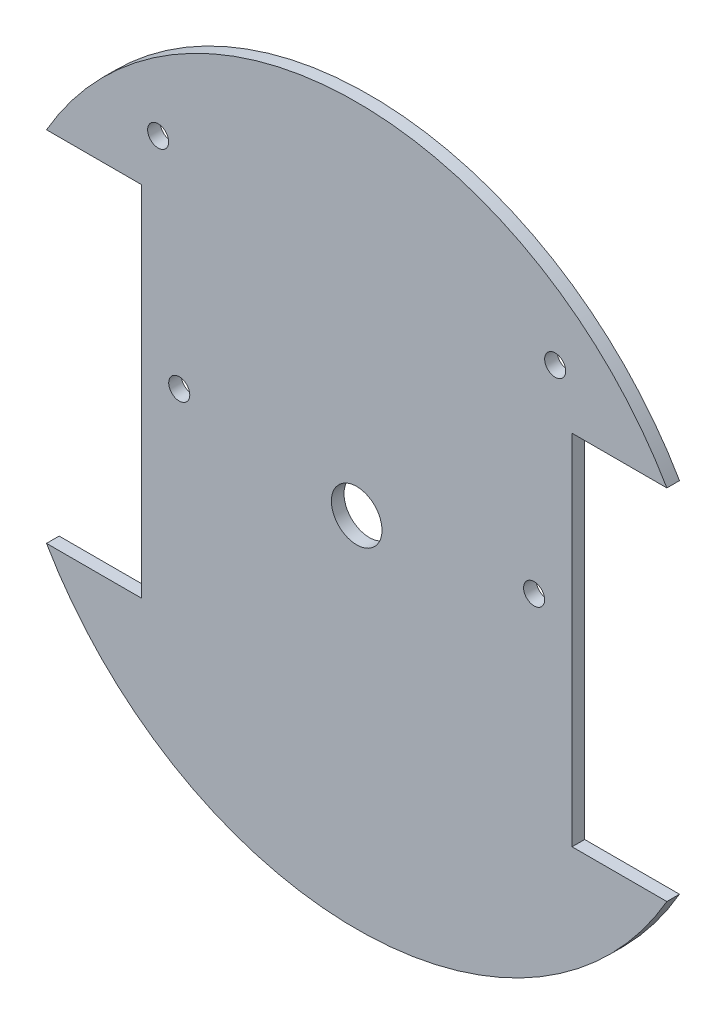
ISO-10303-21;
HEADER;
FILE_DESCRIPTION(('STEP AP214'),'2;1');
FILE_NAME('part.step','',(''),(''),'','','');
FILE_SCHEMA(('AUTOMOTIVE_DESIGN { 1 0 10303 214 1 1 1 1 }'));
ENDSEC;
DATA;
#1=APPLICATION_CONTEXT('core data for automotive mechanical design processes');
#2=APPLICATION_PROTOCOL_DEFINITION('international standard','automotive_design',2000,#1);
#3=PRODUCT_CONTEXT('',#1,'mechanical');
#4=PRODUCT('Part','Part','',(#3));
#5=PRODUCT_RELATED_PRODUCT_CATEGORY('part','',(#4));
#6=PRODUCT_DEFINITION_FORMATION('','',#4);
#7=PRODUCT_DEFINITION_CONTEXT('part definition',#1,'design');
#8=PRODUCT_DEFINITION('design','',#6,#7);
#9=PRODUCT_DEFINITION_SHAPE('','',#8);
#10=(LENGTH_UNIT() NAMED_UNIT(*) SI_UNIT(.MILLI.,.METRE.));
#11=(NAMED_UNIT(*) PLANE_ANGLE_UNIT() SI_UNIT($,.RADIAN.));
#12=(NAMED_UNIT(*) SI_UNIT($,.STERADIAN.) SOLID_ANGLE_UNIT());
#13=UNCERTAINTY_MEASURE_WITH_UNIT(LENGTH_MEASURE(1.E-05),#10,'distance_accuracy_value','');
#14=(GEOMETRIC_REPRESENTATION_CONTEXT(3) GLOBAL_UNCERTAINTY_ASSIGNED_CONTEXT((#13)) GLOBAL_UNIT_ASSIGNED_CONTEXT((#10,
#11,#12)) REPRESENTATION_CONTEXT('',''));
#15=CARTESIAN_POINT('',(0.,0.,0.));
#16=DIRECTION('',(0.,0.,1.));
#17=DIRECTION('',(1.,0.,0.));
#18=AXIS2_PLACEMENT_3D('',#15,#16,#17);
#19=CARTESIAN_POINT('',(-147.959743570363,62.548931244192,3.));
#20=DIRECTION('',(0.,0.,1.));
#21=DIRECTION('',(1.,0.,0.));
#22=AXIS2_PLACEMENT_3D('',#19,#20,#21);
#23=PLANE('',#22);
#24=CARTESIAN_POINT('',(-147.959743570363,62.548931244192,3.));
#25=DIRECTION('',(0.,0.,1.));
#26=DIRECTION('',(1.,0.,0.));
#27=AXIS2_PLACEMENT_3D('',#24,#25,#26);
#28=CIRCLE('',#27,6.00000000000002);
#29=CARTESIAN_POINT('',(-141.959743570363,62.548931244192,3.));
#30=VERTEX_POINT('',#29);
#31=EDGE_CURVE('E197',#30,#30,#28,.T.);
#32=ORIENTED_EDGE('',*,*,#31,.F.);
#33=EDGE_LOOP('',(#32));
#34=FACE_BOUND('',#33,.T.);
#35=CARTESIAN_POINT('',(-195.07190289204,117.048931244192,3.));
#36=DIRECTION('',(0.,0.,1.));
#37=DIRECTION('',(1.,0.,0.));
#38=AXIS2_PLACEMENT_3D('',#35,#36,#37);
#39=CIRCLE('',#38,2.5);
#40=CARTESIAN_POINT('',(-192.57190289204,117.048931244192,3.));
#41=VERTEX_POINT('',#40);
#42=EDGE_CURVE('E185',#41,#41,#39,.T.);
#43=ORIENTED_EDGE('',*,*,#42,.F.);
#44=EDGE_LOOP('',(#43));
#45=FACE_BOUND('',#44,.T.);
#46=CARTESIAN_POINT('',(-100.847584248686,117.048931244192,3.));
#47=DIRECTION('',(0.,0.,1.));
#48=DIRECTION('',(1.,0.,0.));
#49=AXIS2_PLACEMENT_3D('',#46,#47,#48);
#50=CIRCLE('',#49,2.50000000000001);
#51=CARTESIAN_POINT('',(-98.3475842486856,117.048931244192,3.));
#52=VERTEX_POINT('',#51);
#53=EDGE_CURVE('E190',#52,#52,#50,.T.);
#54=ORIENTED_EDGE('',*,*,#53,.F.);
#55=EDGE_LOOP('',(#54));
#56=FACE_BOUND('',#55,.T.);
#57=CARTESIAN_POINT('',(-190.07190289204,67.548931244192,3.));
#58=DIRECTION('',(0.,0.,1.));
#59=DIRECTION('',(1.,0.,0.));
#60=AXIS2_PLACEMENT_3D('',#57,#58,#59);
#61=CIRCLE('',#60,2.5);
#62=CARTESIAN_POINT('',(-187.57190289204,67.548931244192,3.));
#63=VERTEX_POINT('',#62);
#64=EDGE_CURVE('E161',#63,#63,#61,.T.);
#65=ORIENTED_EDGE('',*,*,#64,.F.);
#66=EDGE_LOOP('',(#65));
#67=FACE_BOUND('',#66,.T.);
#68=CARTESIAN_POINT('',(-105.847584248686,67.548931244192,3.));
#69=DIRECTION('',(0.,0.,1.));
#70=DIRECTION('',(1.,0.,0.));
#71=AXIS2_PLACEMENT_3D('',#68,#69,#70);
#72=CIRCLE('',#71,2.5);
#73=CARTESIAN_POINT('',(-103.347584248686,67.548931244192,3.));
#74=VERTEX_POINT('',#73);
#75=EDGE_CURVE('E178',#74,#74,#72,.T.);
#76=ORIENTED_EDGE('',*,*,#75,.F.);
#77=EDGE_LOOP('',(#76));
#78=FACE_BOUND('',#77,.T.);
#79=DIRECTION('',(0.,1.,0.));
#80=VECTOR('',#79,1.);
#81=CARTESIAN_POINT('',(-199.07190289204,62.548931244192,3.));
#82=LINE('',#81,#80);
#83=CARTESIAN_POINT('',(-199.07190289204,20.048931244192,3.));
#84=VERTEX_POINT('',#83);
#85=CARTESIAN_POINT('',(-199.07190289204,105.048931244192,3.));
#86=VERTEX_POINT('',#85);
#87=EDGE_CURVE('E109',#84,#86,#82,.T.);
#88=ORIENTED_EDGE('',*,*,#87,.F.);
#89=DIRECTION('',(-1.,0.,0.));
#90=VECTOR('',#89,1.);
#91=CARTESIAN_POINT('',(-147.959743570363,20.048931244192,3.));
#92=LINE('',#91,#90);
#93=CARTESIAN_POINT('',(-221.57190289204,20.048931244192,3.));
#94=VERTEX_POINT('',#93);
#95=EDGE_CURVE('E135',#84,#94,#92,.T.);
#96=ORIENTED_EDGE('',*,*,#95,.T.);
#97=CARTESIAN_POINT('',(-147.959743570363,62.548931244192,3.));
#98=DIRECTION('',(0.,0.,1.));
#99=DIRECTION('',(1.,0.,0.));
#100=AXIS2_PLACEMENT_3D('',#97,#98,#99);
#101=CIRCLE('',#100,85.);
#102=CARTESIAN_POINT('',(-74.3475842486854,20.048931244192,3.));
#103=VERTEX_POINT('',#102);
#104=EDGE_CURVE('E42',#94,#103,#101,.T.);
#105=ORIENTED_EDGE('',*,*,#104,.T.);
#106=DIRECTION('',(1.,0.,0.));
#107=VECTOR('',#106,1.);
#108=CARTESIAN_POINT('',(-147.959743570363,20.0489312441919,3.));
#109=LINE('',#108,#107);
#110=CARTESIAN_POINT('',(-96.8475842486858,20.048931244192,3.));
#111=VERTEX_POINT('',#110);
#112=EDGE_CURVE('E134',#111,#103,#109,.T.);
#113=ORIENTED_EDGE('',*,*,#112,.F.);
#114=DIRECTION('',(0.,1.,0.));
#115=VECTOR('',#114,1.);
#116=CARTESIAN_POINT('',(-96.8475842486858,62.548931244192,3.));
#117=LINE('',#116,#115);
#118=CARTESIAN_POINT('',(-96.8475842486858,105.048931244192,3.));
#119=VERTEX_POINT('',#118);
#120=EDGE_CURVE('E155',#111,#119,#117,.T.);
#121=ORIENTED_EDGE('',*,*,#120,.T.);
#122=DIRECTION('',(1.,0.,0.));
#123=VECTOR('',#122,1.);
#124=CARTESIAN_POINT('',(-147.959743570363,105.048931244192,3.));
#125=LINE('',#124,#123);
#126=CARTESIAN_POINT('',(-74.3475842486854,105.048931244192,3.));
#127=VERTEX_POINT('',#126);
#128=EDGE_CURVE('E160',#119,#127,#125,.T.);
#129=ORIENTED_EDGE('',*,*,#128,.T.);
#130=CARTESIAN_POINT('',(-221.57190289204,105.048931244192,3.));
#131=VERTEX_POINT('',#130);
#132=EDGE_CURVE('E11',#127,#131,#101,.T.);
#133=ORIENTED_EDGE('',*,*,#132,.T.);
#134=DIRECTION('',(-1.,0.,0.));
#135=VECTOR('',#134,1.);
#136=CARTESIAN_POINT('',(-147.959743570363,105.048931244192,3.));
#137=LINE('',#136,#135);
#138=EDGE_CURVE('E138',#86,#131,#137,.T.);
#139=ORIENTED_EDGE('',*,*,#138,.F.);
#140=EDGE_LOOP('',(#88,#96,#105,#113,#121,#129,#133,#139));
#141=FACE_BOUND('',#140,.T.);
#142=ADVANCED_FACE('F33',(#34,#45,#56,#67,#78,#141),#23,.T.);
#143=CARTESIAN_POINT('',(-147.959743570363,62.548931244192,0.));
#144=DIRECTION('',(0.,0.,1.));
#145=DIRECTION('',(1.,0.,0.));
#146=AXIS2_PLACEMENT_3D('',#143,#144,#145);
#147=PLANE('',#146);
#148=CARTESIAN_POINT('',(-147.959743570363,62.548931244192,0.));
#149=DIRECTION('',(0.,0.,-1.));
#150=DIRECTION('',(-1.,0.,0.));
#151=AXIS2_PLACEMENT_3D('',#148,#149,#150);
#152=CIRCLE('',#151,6.00000000000002);
#153=CARTESIAN_POINT('',(-153.959743570363,62.548931244192,0.));
#154=VERTEX_POINT('',#153);
#155=EDGE_CURVE('E202',#154,#154,#152,.T.);
#156=ORIENTED_EDGE('',*,*,#155,.F.);
#157=EDGE_LOOP('',(#156));
#158=FACE_BOUND('',#157,.T.);
#159=CARTESIAN_POINT('',(-195.07190289204,117.048931244192,0.));
#160=DIRECTION('',(0.,0.,-1.));
#161=DIRECTION('',(-1.,0.,0.));
#162=AXIS2_PLACEMENT_3D('',#159,#160,#161);
#163=CIRCLE('',#162,2.5);
#164=CARTESIAN_POINT('',(-197.57190289204,117.048931244192,0.));
#165=VERTEX_POINT('',#164);
#166=EDGE_CURVE('E193',#165,#165,#163,.T.);
#167=ORIENTED_EDGE('',*,*,#166,.F.);
#168=EDGE_LOOP('',(#167));
#169=FACE_BOUND('',#168,.T.);
#170=CARTESIAN_POINT('',(-100.847584248686,117.048931244192,0.));
#171=DIRECTION('',(0.,0.,-1.));
#172=DIRECTION('',(1.,0.,0.));
#173=AXIS2_PLACEMENT_3D('',#170,#171,#172);
#174=CIRCLE('',#173,2.50000000000001);
#175=CARTESIAN_POINT('',(-98.3475842486856,117.048931244192,0.));
#176=VERTEX_POINT('',#175);
#177=EDGE_CURVE('E194',#176,#176,#174,.T.);
#178=ORIENTED_EDGE('',*,*,#177,.F.);
#179=EDGE_LOOP('',(#178));
#180=FACE_BOUND('',#179,.T.);
#181=CARTESIAN_POINT('',(-190.07190289204,67.548931244192,0.));
#182=DIRECTION('',(0.,0.,-1.));
#183=DIRECTION('',(-1.,0.,0.));
#184=AXIS2_PLACEMENT_3D('',#181,#182,#183);
#185=CIRCLE('',#184,2.5);
#186=CARTESIAN_POINT('',(-192.57190289204,67.548931244192,0.));
#187=VERTEX_POINT('',#186);
#188=EDGE_CURVE('E181',#187,#187,#185,.T.);
#189=ORIENTED_EDGE('',*,*,#188,.F.);
#190=EDGE_LOOP('',(#189));
#191=FACE_BOUND('',#190,.T.);
#192=CARTESIAN_POINT('',(-105.847584248686,67.548931244192,0.));
#193=DIRECTION('',(0.,0.,-1.));
#194=DIRECTION('',(-1.,0.,0.));
#195=AXIS2_PLACEMENT_3D('',#192,#193,#194);
#196=CIRCLE('',#195,2.5);
#197=CARTESIAN_POINT('',(-108.347584248686,67.548931244192,0.));
#198=VERTEX_POINT('',#197);
#199=EDGE_CURVE('E182',#198,#198,#196,.T.);
#200=ORIENTED_EDGE('',*,*,#199,.F.);
#201=EDGE_LOOP('',(#200));
#202=FACE_BOUND('',#201,.T.);
#203=DIRECTION('',(-1.,0.,0.));
#204=VECTOR('',#203,1.);
#205=CARTESIAN_POINT('',(-147.959743570363,20.048931244192,0.));
#206=LINE('',#205,#204);
#207=CARTESIAN_POINT('',(-199.07190289204,20.048931244192,0.));
#208=VERTEX_POINT('',#207);
#209=CARTESIAN_POINT('',(-221.57190289204,20.048931244192,0.));
#210=VERTEX_POINT('',#209);
#211=EDGE_CURVE('E98',#208,#210,#206,.T.);
#212=ORIENTED_EDGE('',*,*,#211,.F.);
#213=DIRECTION('',(0.,1.,0.));
#214=VECTOR('',#213,1.);
#215=CARTESIAN_POINT('',(-199.07190289204,62.548931244192,0.));
#216=LINE('',#215,#214);
#217=CARTESIAN_POINT('',(-199.07190289204,105.048931244192,0.));
#218=VERTEX_POINT('',#217);
#219=EDGE_CURVE('E144',#208,#218,#216,.T.);
#220=ORIENTED_EDGE('',*,*,#219,.T.);
#221=DIRECTION('',(-1.,0.,0.));
#222=VECTOR('',#221,1.);
#223=CARTESIAN_POINT('',(-147.959743570363,105.048931244192,0.));
#224=LINE('',#223,#222);
#225=CARTESIAN_POINT('',(-221.57190289204,105.048931244192,0.));
#226=VERTEX_POINT('',#225);
#227=EDGE_CURVE('E49',#218,#226,#224,.T.);
#228=ORIENTED_EDGE('',*,*,#227,.T.);
#229=CARTESIAN_POINT('',(-147.959743570363,62.548931244192,0.));
#230=DIRECTION('',(0.,0.,1.));
#231=DIRECTION('',(1.,0.,0.));
#232=AXIS2_PLACEMENT_3D('',#229,#230,#231);
#233=CIRCLE('',#232,85.);
#234=CARTESIAN_POINT('',(-74.3475842486854,105.048931244192,0.));
#235=VERTEX_POINT('',#234);
#236=EDGE_CURVE('E124',#235,#226,#233,.T.);
#237=ORIENTED_EDGE('',*,*,#236,.F.);
#238=DIRECTION('',(1.,0.,0.));
#239=VECTOR('',#238,1.);
#240=CARTESIAN_POINT('',(-147.959743570363,105.048931244192,0.));
#241=LINE('',#240,#239);
#242=CARTESIAN_POINT('',(-96.8475842486858,105.048931244192,0.));
#243=VERTEX_POINT('',#242);
#244=EDGE_CURVE('E154',#243,#235,#241,.T.);
#245=ORIENTED_EDGE('',*,*,#244,.F.);
#246=DIRECTION('',(0.,1.,0.));
#247=VECTOR('',#246,1.);
#248=CARTESIAN_POINT('',(-96.8475842486858,62.548931244192,0.));
#249=LINE('',#248,#247);
#250=CARTESIAN_POINT('',(-96.8475842486858,20.048931244192,0.));
#251=VERTEX_POINT('',#250);
#252=EDGE_CURVE('E157',#251,#243,#249,.T.);
#253=ORIENTED_EDGE('',*,*,#252,.F.);
#254=DIRECTION('',(1.,0.,0.));
#255=VECTOR('',#254,1.);
#256=CARTESIAN_POINT('',(-147.959743570363,20.0489312441919,0.));
#257=LINE('',#256,#255);
#258=CARTESIAN_POINT('',(-74.3475842486854,20.048931244192,0.));
#259=VERTEX_POINT('',#258);
#260=EDGE_CURVE('E123',#251,#259,#257,.T.);
#261=ORIENTED_EDGE('',*,*,#260,.T.);
#262=EDGE_CURVE('E37',#210,#259,#233,.T.);
#263=ORIENTED_EDGE('',*,*,#262,.F.);
#264=EDGE_LOOP('',(#212,#220,#228,#237,#245,#253,#261,#263));
#265=FACE_BOUND('',#264,.T.);
#266=ADVANCED_FACE('F120',(#158,#169,#180,#191,#202,#265),#147,.F.);
#267=CARTESIAN_POINT('',(-147.959743570363,62.548931244192,3.));
#268=DIRECTION('',(0.,0.,-1.));
#269=DIRECTION('',(-1.,0.,0.));
#270=AXIS2_PLACEMENT_3D('',#267,#268,#269);
#271=CYLINDRICAL_SURFACE('',#270,85.);
#272=ORIENTED_EDGE('',*,*,#236,.T.);
#273=DIRECTION('',(0.,0.,1.));
#274=VECTOR('',#273,1.);
#275=CARTESIAN_POINT('',(-221.57190289204,105.048931244192,0.));
#276=LINE('',#275,#274);
#277=EDGE_CURVE('E117',#226,#131,#276,.T.);
#278=ORIENTED_EDGE('',*,*,#277,.T.);
#279=ORIENTED_EDGE('',*,*,#132,.F.);
#280=DIRECTION('',(0.,0.,-1.));
#281=VECTOR('',#280,1.);
#282=CARTESIAN_POINT('',(-74.3475842486854,105.048931244192,3.));
#283=LINE('',#282,#281);
#284=EDGE_CURVE('E116',#235,#127,#283,.F.);
#285=ORIENTED_EDGE('',*,*,#284,.F.);
#286=EDGE_LOOP('',(#272,#278,#279,#285));
#287=FACE_BOUND('',#286,.T.);
#288=ADVANCED_FACE('F172',(#287),#271,.T.);
#289=DIRECTION('',(0.,0.,1.));
#290=VECTOR('',#289,1.);
#291=CARTESIAN_POINT('',(-221.57190289204,20.048931244192,0.));
#292=LINE('',#291,#290);
#293=EDGE_CURVE('E102',#210,#94,#292,.T.);
#294=ORIENTED_EDGE('',*,*,#293,.F.);
#295=ORIENTED_EDGE('',*,*,#262,.T.);
#296=DIRECTION('',(0.,0.,-1.));
#297=VECTOR('',#296,1.);
#298=CARTESIAN_POINT('',(-74.3475842486854,20.048931244192,3.));
#299=LINE('',#298,#297);
#300=EDGE_CURVE('E125',#259,#103,#299,.F.);
#301=ORIENTED_EDGE('',*,*,#300,.T.);
#302=ORIENTED_EDGE('',*,*,#104,.F.);
#303=EDGE_LOOP('',(#294,#295,#301,#302));
#304=FACE_BOUND('',#303,.T.);
#305=ADVANCED_FACE('F35',(#304),#271,.T.);
#306=CARTESIAN_POINT('',(-147.959743570363,20.0489312441919,0.));
#307=DIRECTION('',(0.,-1.,0.));
#308=DIRECTION('',(1.,0.,0.));
#309=AXIS2_PLACEMENT_3D('',#306,#307,#308);
#310=PLANE('',#309);
#311=ORIENTED_EDGE('',*,*,#260,.F.);
#312=DIRECTION('',(0.,0.,1.));
#313=VECTOR('',#312,1.);
#314=CARTESIAN_POINT('',(-96.8475842486858,20.048931244192,0.));
#315=LINE('',#314,#313);
#316=EDGE_CURVE('E139',#251,#111,#315,.T.);
#317=ORIENTED_EDGE('',*,*,#316,.T.);
#318=ORIENTED_EDGE('',*,*,#112,.T.);
#319=ORIENTED_EDGE('',*,*,#300,.F.);
#320=EDGE_LOOP('',(#311,#317,#318,#319));
#321=FACE_BOUND('',#320,.T.);
#322=ADVANCED_FACE('F240',(#321),#310,.F.);
#323=CARTESIAN_POINT('',(-147.959743570363,105.048931244192,0.));
#324=DIRECTION('',(0.,-1.,0.));
#325=DIRECTION('',(0.,0.,-1.));
#326=AXIS2_PLACEMENT_3D('',#323,#324,#325);
#327=PLANE('',#326);
#328=ORIENTED_EDGE('',*,*,#284,.T.);
#329=ORIENTED_EDGE('',*,*,#128,.F.);
#330=DIRECTION('',(0.,0.,1.));
#331=VECTOR('',#330,1.);
#332=CARTESIAN_POINT('',(-96.8475842486858,105.048931244192,0.));
#333=LINE('',#332,#331);
#334=EDGE_CURVE('E57',#243,#119,#333,.T.);
#335=ORIENTED_EDGE('',*,*,#334,.F.);
#336=ORIENTED_EDGE('',*,*,#244,.T.);
#337=EDGE_LOOP('',(#328,#329,#335,#336));
#338=FACE_BOUND('',#337,.T.);
#339=ADVANCED_FACE('F168',(#338),#327,.T.);
#340=CARTESIAN_POINT('',(-96.8475842486858,62.548931244192,0.));
#341=DIRECTION('',(1.,0.,0.));
#342=DIRECTION('',(0.,0.,-1.));
#343=AXIS2_PLACEMENT_3D('',#340,#341,#342);
#344=PLANE('',#343);
#345=ORIENTED_EDGE('',*,*,#120,.F.);
#346=ORIENTED_EDGE('',*,*,#316,.F.);
#347=ORIENTED_EDGE('',*,*,#252,.T.);
#348=ORIENTED_EDGE('',*,*,#334,.T.);
#349=EDGE_LOOP('',(#345,#346,#347,#348));
#350=FACE_BOUND('',#349,.T.);
#351=ADVANCED_FACE('F166',(#350),#344,.T.);
#352=CARTESIAN_POINT('',(-199.07190289204,62.548931244192,0.));
#353=DIRECTION('',(1.,0.,0.));
#354=DIRECTION('',(0.,0.,-1.));
#355=AXIS2_PLACEMENT_3D('',#352,#353,#354);
#356=PLANE('',#355);
#357=ORIENTED_EDGE('',*,*,#87,.T.);
#358=DIRECTION('',(0.,0.,1.));
#359=VECTOR('',#358,1.);
#360=CARTESIAN_POINT('',(-199.07190289204,105.048931244192,0.));
#361=LINE('',#360,#359);
#362=EDGE_CURVE('E149',#218,#86,#361,.T.);
#363=ORIENTED_EDGE('',*,*,#362,.F.);
#364=ORIENTED_EDGE('',*,*,#219,.F.);
#365=DIRECTION('',(0.,0.,1.));
#366=VECTOR('',#365,1.);
#367=CARTESIAN_POINT('',(-199.07190289204,20.048931244192,0.));
#368=LINE('',#367,#366);
#369=EDGE_CURVE('E104',#208,#84,#368,.T.);
#370=ORIENTED_EDGE('',*,*,#369,.T.);
#371=EDGE_LOOP('',(#357,#363,#364,#370));
#372=FACE_BOUND('',#371,.T.);
#373=ADVANCED_FACE('F247',(#372),#356,.F.);
#374=CARTESIAN_POINT('',(-147.959743570363,105.048931244192,0.));
#375=DIRECTION('',(0.,1.,0.));
#376=DIRECTION('',(-1.,0.,0.));
#377=AXIS2_PLACEMENT_3D('',#374,#375,#376);
#378=PLANE('',#377);
#379=ORIENTED_EDGE('',*,*,#138,.T.);
#380=ORIENTED_EDGE('',*,*,#277,.F.);
#381=ORIENTED_EDGE('',*,*,#227,.F.);
#382=ORIENTED_EDGE('',*,*,#362,.T.);
#383=EDGE_LOOP('',(#379,#380,#381,#382));
#384=FACE_BOUND('',#383,.T.);
#385=ADVANCED_FACE('F174',(#384),#378,.F.);
#386=CARTESIAN_POINT('',(-147.959743570363,20.048931244192,0.));
#387=DIRECTION('',(0.,1.,0.));
#388=DIRECTION('',(-1.,0.,0.));
#389=AXIS2_PLACEMENT_3D('',#386,#387,#388);
#390=PLANE('',#389);
#391=ORIENTED_EDGE('',*,*,#95,.F.);
#392=ORIENTED_EDGE('',*,*,#369,.F.);
#393=ORIENTED_EDGE('',*,*,#211,.T.);
#394=ORIENTED_EDGE('',*,*,#293,.T.);
#395=EDGE_LOOP('',(#391,#392,#393,#394));
#396=FACE_BOUND('',#395,.T.);
#397=ADVANCED_FACE('F101',(#396),#390,.T.);
#398=CARTESIAN_POINT('',(-105.847584248686,67.548931244192,10.));
#399=DIRECTION('',(0.,0.,-1.));
#400=DIRECTION('',(-1.,0.,0.));
#401=AXIS2_PLACEMENT_3D('',#398,#399,#400);
#402=CYLINDRICAL_SURFACE('',#401,2.5);
#403=ORIENTED_EDGE('',*,*,#75,.T.);
#404=EDGE_LOOP('',(#403));
#405=FACE_BOUND('',#404,.T.);
#406=ORIENTED_EDGE('',*,*,#199,.T.);
#407=EDGE_LOOP('',(#406));
#408=FACE_BOUND('',#407,.T.);
#409=ADVANCED_FACE('F218',(#405,#408),#402,.F.);
#410=CARTESIAN_POINT('',(-190.07190289204,67.548931244192,10.));
#411=DIRECTION('',(0.,0.,-1.));
#412=DIRECTION('',(-1.,0.,0.));
#413=AXIS2_PLACEMENT_3D('',#410,#411,#412);
#414=CYLINDRICAL_SURFACE('',#413,2.5);
#415=ORIENTED_EDGE('',*,*,#64,.T.);
#416=EDGE_LOOP('',(#415));
#417=FACE_BOUND('',#416,.T.);
#418=ORIENTED_EDGE('',*,*,#188,.T.);
#419=EDGE_LOOP('',(#418));
#420=FACE_BOUND('',#419,.T.);
#421=ADVANCED_FACE('F220',(#417,#420),#414,.F.);
#422=CARTESIAN_POINT('',(-100.847584248686,117.048931244192,10.));
#423=DIRECTION('',(0.,0.,-1.));
#424=DIRECTION('',(-1.,0.,0.));
#425=AXIS2_PLACEMENT_3D('',#422,#423,#424);
#426=CYLINDRICAL_SURFACE('',#425,2.50000000000001);
#427=ORIENTED_EDGE('',*,*,#53,.T.);
#428=EDGE_LOOP('',(#427));
#429=FACE_BOUND('',#428,.T.);
#430=ORIENTED_EDGE('',*,*,#177,.T.);
#431=EDGE_LOOP('',(#430));
#432=FACE_BOUND('',#431,.T.);
#433=ADVANCED_FACE('F227',(#429,#432),#426,.F.);
#434=CARTESIAN_POINT('',(-195.07190289204,117.048931244192,10.));
#435=DIRECTION('',(0.,0.,-1.));
#436=DIRECTION('',(-1.,0.,0.));
#437=AXIS2_PLACEMENT_3D('',#434,#435,#436);
#438=CYLINDRICAL_SURFACE('',#437,2.5);
#439=ORIENTED_EDGE('',*,*,#42,.T.);
#440=EDGE_LOOP('',(#439));
#441=FACE_BOUND('',#440,.T.);
#442=ORIENTED_EDGE('',*,*,#166,.T.);
#443=EDGE_LOOP('',(#442));
#444=FACE_BOUND('',#443,.T.);
#445=ADVANCED_FACE('F283',(#441,#444),#438,.F.);
#446=CARTESIAN_POINT('',(-147.959743570363,62.548931244192,10.));
#447=DIRECTION('',(0.,0.,-1.));
#448=DIRECTION('',(-1.,0.,0.));
#449=AXIS2_PLACEMENT_3D('',#446,#447,#448);
#450=CYLINDRICAL_SURFACE('',#449,6.00000000000002);
#451=ORIENTED_EDGE('',*,*,#31,.T.);
#452=EDGE_LOOP('',(#451));
#453=FACE_BOUND('',#452,.T.);
#454=ORIENTED_EDGE('',*,*,#155,.T.);
#455=EDGE_LOOP('',(#454));
#456=FACE_BOUND('',#455,.T.);
#457=ADVANCED_FACE('F206',(#453,#456),#450,.F.);
#458=CLOSED_SHELL('',(#142,#266,#288,#305,#322,#339,#351,#373,#385,#397,#409,#421,#433,#445,#457));
#459=MANIFOLD_SOLID_BREP('B2',#458);
#460=ADVANCED_BREP_SHAPE_REPRESENTATION('',(#18,#459),#14);
#461=SHAPE_DEFINITION_REPRESENTATION(#9,#460);
ENDSEC;
END-ISO-10303-21;
